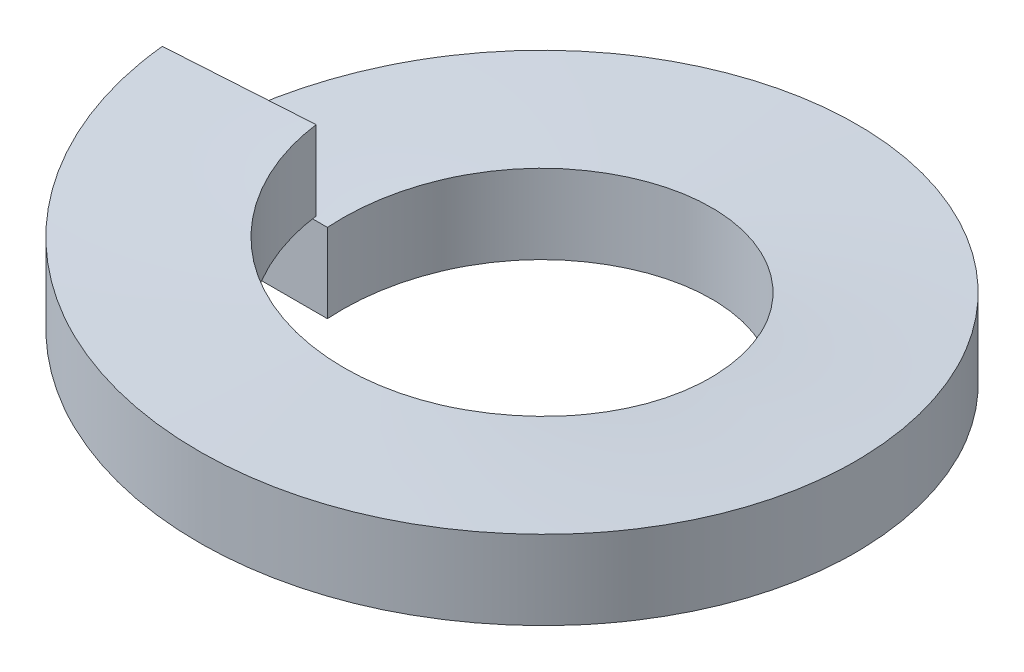
ISO-10303-21;
HEADER;
FILE_DESCRIPTION(('STEP AP214'),'2;1');
FILE_NAME('part.step','',(''),(''),'','','');
FILE_SCHEMA(('AUTOMOTIVE_DESIGN { 1 0 10303 214 1 1 1 1 }'));
ENDSEC;
DATA;
#1=APPLICATION_CONTEXT('core data for automotive mechanical design processes');
#2=APPLICATION_PROTOCOL_DEFINITION('international standard','automotive_design',2000,#1);
#3=PRODUCT_CONTEXT('',#1,'mechanical');
#4=PRODUCT('Part','Part','',(#3));
#5=PRODUCT_RELATED_PRODUCT_CATEGORY('part','',(#4));
#6=PRODUCT_DEFINITION_FORMATION('','',#4);
#7=PRODUCT_DEFINITION_CONTEXT('part definition',#1,'design');
#8=PRODUCT_DEFINITION('design','',#6,#7);
#9=PRODUCT_DEFINITION_SHAPE('','',#8);
#10=(LENGTH_UNIT() NAMED_UNIT(*) SI_UNIT(.MILLI.,.METRE.));
#11=(NAMED_UNIT(*) PLANE_ANGLE_UNIT() SI_UNIT($,.RADIAN.));
#12=(NAMED_UNIT(*) SI_UNIT($,.STERADIAN.) SOLID_ANGLE_UNIT());
#13=UNCERTAINTY_MEASURE_WITH_UNIT(LENGTH_MEASURE(1.E-05),#10,'distance_accuracy_value','');
#14=(GEOMETRIC_REPRESENTATION_CONTEXT(3) GLOBAL_UNCERTAINTY_ASSIGNED_CONTEXT((#13)) GLOBAL_UNIT_ASSIGNED_CONTEXT((#10,
#11,#12)) REPRESENTATION_CONTEXT('',''));
#15=CARTESIAN_POINT('',(0.,0.,0.));
#16=DIRECTION('',(0.,0.,1.));
#17=DIRECTION('',(1.,0.,0.));
#18=AXIS2_PLACEMENT_3D('',#15,#16,#17);
#19=CARTESIAN_POINT('',(-3.175,0.762,0.));
#20=DIRECTION('',(0.,0.,1.));
#21=DIRECTION('',(1.,0.,0.));
#22=AXIS2_PLACEMENT_3D('',#19,#20,#21);
#23=PLANE('',#22);
#24=DIRECTION('',(0.,-1.,0.));
#25=VECTOR('',#24,1.);
#26=CARTESIAN_POINT('',(-3.175,0.762,0.));
#27=LINE('',#26,#25);
#28=CARTESIAN_POINT('',(-3.175,0.762,0.));
#29=VERTEX_POINT('',#28);
#30=CARTESIAN_POINT('',(-3.175,0.,0.));
#31=VERTEX_POINT('',#30);
#32=EDGE_CURVE('E84',#29,#31,#27,.T.);
#33=ORIENTED_EDGE('',*,*,#32,.T.);
#34=DIRECTION('',(1.,0.,0.));
#35=VECTOR('',#34,1.);
#36=CARTESIAN_POINT('',(-3.175,0.,0.));
#37=LINE('',#36,#35);
#38=CARTESIAN_POINT('',(-1.778,0.,0.));
#39=VERTEX_POINT('',#38);
#40=EDGE_CURVE('E77',#31,#39,#37,.T.);
#41=ORIENTED_EDGE('',*,*,#40,.T.);
#42=DIRECTION('',(0.,1.,0.));
#43=VECTOR('',#42,1.);
#44=CARTESIAN_POINT('',(-1.778,0.762,0.));
#45=LINE('',#44,#43);
#46=CARTESIAN_POINT('',(-1.778,0.762,0.));
#47=VERTEX_POINT('',#46);
#48=EDGE_CURVE('E72',#39,#47,#45,.T.);
#49=ORIENTED_EDGE('',*,*,#48,.T.);
#50=DIRECTION('',(-1.,0.,0.));
#51=VECTOR('',#50,1.);
#52=CARTESIAN_POINT('',(-3.175,0.762,0.));
#53=LINE('',#52,#51);
#54=EDGE_CURVE('E67',#47,#29,#53,.T.);
#55=ORIENTED_EDGE('',*,*,#54,.T.);
#56=EDGE_LOOP('',(#33,#41,#49,#55));
#57=FACE_BOUND('',#56,.T.);
#58=ADVANCED_FACE('F32',(#57),#23,.T.);
#59=CARTESIAN_POINT('',(-3.16873486275976,1.6764,0.199359899505527));
#60=DIRECTION('',(0.0627905195293,0.,0.998026728428272));
#61=DIRECTION('',(0.998026728428272,0.,-0.0627905195293));
#62=AXIS2_PLACEMENT_3D('',#59,#60,#61);
#63=PLANE('',#62);
#64=DIRECTION('',(0.,-1.,0.));
#65=VECTOR('',#64,1.);
#66=CARTESIAN_POINT('',(-3.16873486275976,1.6764,0.199359899505527));
#67=LINE('',#66,#65);
#68=CARTESIAN_POINT('',(-3.16873486275976,1.6764,0.199359899505526));
#69=VERTEX_POINT('',#68);
#70=CARTESIAN_POINT('',(-3.16873486275977,0.9144,0.199359899505526));
#71=VERTEX_POINT('',#70);
#72=EDGE_CURVE('E92',#69,#71,#67,.T.);
#73=ORIENTED_EDGE('',*,*,#72,.F.);
#74=DIRECTION('',(-0.998026728428272,0.,0.0627905195293));
#75=VECTOR('',#74,1.);
#76=CARTESIAN_POINT('',(-3.16873486275976,1.6764,0.199359899505527));
#77=LINE('',#76,#75);
#78=CARTESIAN_POINT('',(-1.77449152314547,1.6764,0.111641543723095));
#79=VERTEX_POINT('',#78);
#80=EDGE_CURVE('E11',#79,#69,#77,.T.);
#81=ORIENTED_EDGE('',*,*,#80,.F.);
#82=DIRECTION('',(0.,1.,0.));
#83=VECTOR('',#82,1.);
#84=CARTESIAN_POINT('',(-1.77449152314547,1.6764,0.111641543723095));
#85=LINE('',#84,#83);
#86=CARTESIAN_POINT('',(-1.77449152314547,0.9144,0.111641543723095));
#87=VERTEX_POINT('',#86);
#88=EDGE_CURVE('E46',#87,#79,#85,.T.);
#89=ORIENTED_EDGE('',*,*,#88,.F.);
#90=DIRECTION('',(0.998026728428272,0.,-0.0627905195293));
#91=VECTOR('',#90,1.);
#92=CARTESIAN_POINT('',(-3.16873486275977,0.9144,0.199359899505527));
#93=LINE('',#92,#91);
#94=EDGE_CURVE('E55',#71,#87,#93,.T.);
#95=ORIENTED_EDGE('',*,*,#94,.F.);
#96=EDGE_LOOP('',(#73,#81,#89,#95));
#97=FACE_BOUND('',#96,.T.);
#98=ADVANCED_FACE('F138',(#97),#63,.F.);
#99=CARTESIAN_POINT('',(0.,0.,0.));
#100=DIRECTION('',(0.,1.,0.));
#101=DIRECTION('',(0.,0.,1.));
#102=AXIS2_PLACEMENT_3D('',#99,#100,#101);
#103=CYLINDRICAL_SURFACE('',#102,3.175);
#104=CARTESIAN_POINT('',(-3.175,0.,0.));
#105=CARTESIAN_POINT('',(-3.175,0.0762,-1.81098802671272));
#106=CARTESIAN_POINT('',(-1.61620649500742,0.1524,-2.73285593573752));
#107=CARTESIAN_POINT('',(-0.0574129900148447,0.2286,-3.65472384476233));
#108=CARTESIAN_POINT('',(1.52956791527296,0.3048,-2.78227370913926));
#109=CARTESIAN_POINT('',(3.11654882056076,0.381,-1.90982357351619));
#110=CARTESIAN_POINT('',(3.1734333291612,0.4572,-0.0997291600730346));
#111=CARTESIAN_POINT('',(3.23031783776163,0.5334,1.71036525337012));
#112=CARTESIAN_POINT('',(1.70125007405829,0.6096,2.68074116346891));
#113=CARTESIAN_POINT('',(0.172182310354944,0.6858,3.65111707356771));
#114=CARTESIAN_POINT('',(-1.44141983667309,0.762,2.82894571429805));
#115=CARTESIAN_POINT('',(-3.05502198370113,0.8382,2.00677435502839));
#116=CARTESIAN_POINT('',(-3.16873486275977,0.9144,0.199359899505525));
#117=(BOUNDED_CURVE() B_SPLINE_CURVE(2,(#104,#105,#106,#107,#108,#109,#110,#111,#112,#113,#114,
#115,#116),.UNSPECIFIED.,.F.,.F.) B_SPLINE_CURVE_WITH_KNOTS((3,2,2,2,2,2,3),(0.,
0.166666666666667,0.333333333333333,0.5,0.666666666666667,0.833333333333333,1.),
.UNSPECIFIED.) CURVE() GEOMETRIC_REPRESENTATION_ITEM() RATIONAL_B_SPLINE_CURVE((1.,
0.868631514438191,1.,0.868631514438191,1.,0.868631514438191,1.,0.868631514438191,1.,
0.868631514438191,1.,0.868631514438191,1.)) REPRESENTATION_ITEM(''));
#118=EDGE_CURVE('E87',#31,#71,#117,.T.);
#119=ORIENTED_EDGE('',*,*,#118,.F.);
#120=ORIENTED_EDGE('',*,*,#32,.F.);
#121=CARTESIAN_POINT('',(-3.175,0.762,0.));
#122=CARTESIAN_POINT('',(-3.175,0.8382,-1.81098802671272));
#123=CARTESIAN_POINT('',(-1.61620649500742,0.9144,-2.73285593573752));
#124=CARTESIAN_POINT('',(-0.0574129900148447,0.9906,-3.65472384476233));
#125=CARTESIAN_POINT('',(1.52956791527296,1.0668,-2.78227370913926));
#126=CARTESIAN_POINT('',(3.11654882056076,1.143,-1.90982357351619));
#127=CARTESIAN_POINT('',(3.1734333291612,1.2192,-0.0997291600730346));
#128=CARTESIAN_POINT('',(3.23031783776163,1.2954,1.71036525337012));
#129=CARTESIAN_POINT('',(1.70125007405829,1.3716,2.68074116346891));
#130=CARTESIAN_POINT('',(0.172182310354944,1.4478,3.65111707356771));
#131=CARTESIAN_POINT('',(-1.44141983667309,1.524,2.82894571429805));
#132=CARTESIAN_POINT('',(-3.05502198370113,1.6002,2.00677435502839));
#133=CARTESIAN_POINT('',(-3.16873486275976,1.6764,0.199359899505525));
#134=(BOUNDED_CURVE() B_SPLINE_CURVE(2,(#121,#122,#123,#124,#125,#126,#127,#128,#129,#130,#131,
#132,#133),.UNSPECIFIED.,.F.,.F.) B_SPLINE_CURVE_WITH_KNOTS((3,2,2,2,2,2,3),(0.,
0.166666666666667,0.333333333333333,0.5,0.666666666666667,0.833333333333333,1.),
.UNSPECIFIED.) CURVE() GEOMETRIC_REPRESENTATION_ITEM() RATIONAL_B_SPLINE_CURVE((1.,
0.868631514438191,1.,0.868631514438191,1.,0.868631514438191,1.,0.868631514438191,1.,
0.868631514438191,1.,0.868631514438191,1.)) REPRESENTATION_ITEM(''));
#135=EDGE_CURVE('E86',#29,#69,#134,.T.);
#136=ORIENTED_EDGE('',*,*,#135,.T.);
#137=ORIENTED_EDGE('',*,*,#72,.T.);
#138=EDGE_LOOP('',(#119,#120,#136,#137));
#139=FACE_BOUND('',#138,.T.);
#140=ADVANCED_FACE('F85',(#139),#103,.T.);
#141=CARTESIAN_POINT('',(-3.175,0.,0.));
#142=CARTESIAN_POINT('',(-3.175,0.0762,-1.81098802671272));
#143=CARTESIAN_POINT('',(-1.61620649500742,0.1524,-2.73285593573753));
#144=CARTESIAN_POINT('',(-0.0574129900148447,0.2286,-3.65472384476233));
#145=CARTESIAN_POINT('',(1.52956791527296,0.3048,-2.78227370913926));
#146=CARTESIAN_POINT('',(3.11654882056076,0.381,-1.90982357351619));
#147=CARTESIAN_POINT('',(3.1734333291612,0.4572,-0.0997291600730346));
#148=CARTESIAN_POINT('',(3.23031783776163,0.5334,1.71036525337012));
#149=CARTESIAN_POINT('',(1.70125007405829,0.6096,2.68074116346891));
#150=CARTESIAN_POINT('',(0.172182310354944,0.6858,3.65111707356771));
#151=CARTESIAN_POINT('',(-1.44141983667309,0.762,2.82894571429805));
#152=CARTESIAN_POINT('',(-3.05502198370113,0.8382,2.00677435502839));
#153=CARTESIAN_POINT('',(-3.16873486275977,0.9144,0.199359899505525));
#154=CARTESIAN_POINT('',(-1.778,0.,0.));
#155=CARTESIAN_POINT('',(-1.778,0.0762,-1.01415329495912));
#156=CARTESIAN_POINT('',(-0.905075637204157,0.1524,-1.53039932401301));
#157=CARTESIAN_POINT('',(-0.032151274408313,0.2286,-2.04664535306691));
#158=CARTESIAN_POINT('',(0.856558032552857,0.3048,-1.55807327711799));
#159=CARTESIAN_POINT('',(1.74526733951403,0.381,-1.06950120116906));
#160=CARTESIAN_POINT('',(1.77712266433027,0.4572,-0.0558483296408994));
#161=CARTESIAN_POINT('',(1.80897798914651,0.5334,0.957804541887265));
#162=CARTESIAN_POINT('',(0.952700041472642,0.6096,1.50121505154259));
#163=CARTESIAN_POINT('',(0.0964220937987685,0.6858,2.04462556119792));
#164=CARTESIAN_POINT('',(-0.807195108536932,0.762,1.58420960000691));
#165=CARTESIAN_POINT('',(-1.71081231087263,0.8382,1.1237936388159));
#166=CARTESIAN_POINT('',(-1.77449152314547,0.9144,0.111641543723094));
#167=(BOUNDED_SURFACE() B_SPLINE_SURFACE(1,2,((#141,#142,#143,#144,#145,#146,#147,#148,#149,
#150,#151,#152,#153),(#154,#155,#156,#157,#158,#159,#160,#161,#162,#163,#164,#165,#166)),
.UNSPECIFIED.,.F.,.F.,.F.) B_SPLINE_SURFACE_WITH_KNOTS((2,2),(3,2,2,2,2,2,3),(0.,1.),(0.,
0.166666666666667,0.333333333333333,0.5,0.666666666666667,0.833333333333333,1.),
.UNSPECIFIED.) GEOMETRIC_REPRESENTATION_ITEM() RATIONAL_B_SPLINE_SURFACE(((1.,0.868631514438191,
1.,0.868631514438191,1.,0.868631514438191,1.,0.868631514438191,1.,0.868631514438191,1.,
0.868631514438191,1.),(1.,0.868631514438191,1.,0.868631514438191,1.,0.868631514438191,1.,
0.868631514438191,1.,0.868631514438191,1.,0.868631514438191,1.))) REPRESENTATION_ITEM('') SURFACE());
#168=CARTESIAN_POINT('',(-1.778,0.,0.));
#169=CARTESIAN_POINT('',(-1.778,0.0762,-1.01415329495912));
#170=CARTESIAN_POINT('',(-0.905075637204157,0.1524,-1.53039932401301));
#171=CARTESIAN_POINT('',(-0.032151274408313,0.2286,-2.04664535306691));
#172=CARTESIAN_POINT('',(0.856558032552857,0.3048,-1.55807327711799));
#173=CARTESIAN_POINT('',(1.74526733951403,0.381,-1.06950120116906));
#174=CARTESIAN_POINT('',(1.77712266433027,0.4572,-0.0558483296408994));
#175=CARTESIAN_POINT('',(1.80897798914651,0.5334,0.957804541887265));
#176=CARTESIAN_POINT('',(0.952700041472642,0.6096,1.50121505154259));
#177=CARTESIAN_POINT('',(0.0964220937987685,0.6858,2.04462556119792));
#178=CARTESIAN_POINT('',(-0.807195108536932,0.762,1.58420960000691));
#179=CARTESIAN_POINT('',(-1.71081231087263,0.8382,1.1237936388159));
#180=CARTESIAN_POINT('',(-1.77449152314547,0.9144,0.111641543723094));
#181=(BOUNDED_CURVE() B_SPLINE_CURVE(2,(#168,#169,#170,#171,#172,#173,#174,#175,#176,#177,#178,
#179,#180),.UNSPECIFIED.,.F.,.F.) B_SPLINE_CURVE_WITH_KNOTS((3,2,2,2,2,2,3),(0.,
0.166666666666667,0.333333333333333,0.5,0.666666666666667,0.833333333333333,1.),
.UNSPECIFIED.) CURVE() GEOMETRIC_REPRESENTATION_ITEM() RATIONAL_B_SPLINE_CURVE((1.,
0.868631514438191,1.,0.868631514438191,1.,0.868631514438191,1.,0.868631514438191,1.,
0.868631514438191,1.,0.868631514438191,1.)) REPRESENTATION_ITEM(''));
#182=EDGE_CURVE('E107',#39,#87,#181,.T.);
#183=ORIENTED_EDGE('',*,*,#182,.F.);
#184=ORIENTED_EDGE('',*,*,#40,.F.);
#185=ORIENTED_EDGE('',*,*,#118,.T.);
#186=ORIENTED_EDGE('',*,*,#94,.T.);
#187=EDGE_LOOP('',(#183,#184,#185,#186));
#188=FACE_BOUND('',#187,.T.);
#189=ADVANCED_FACE('F125',(#188),#167,.F.);
#190=CARTESIAN_POINT('',(0.,0.,0.));
#191=DIRECTION('',(0.,1.,0.));
#192=DIRECTION('',(0.,0.,1.));
#193=AXIS2_PLACEMENT_3D('',#190,#191,#192);
#194=CYLINDRICAL_SURFACE('',#193,1.778);
#195=CARTESIAN_POINT('',(-1.778,0.762,0.));
#196=CARTESIAN_POINT('',(-1.778,0.8382,-1.01415329495912));
#197=CARTESIAN_POINT('',(-0.905075637204156,0.9144,-1.53039932401301));
#198=CARTESIAN_POINT('',(-0.032151274408313,0.9906,-2.04664535306691));
#199=CARTESIAN_POINT('',(0.856558032552857,1.0668,-1.55807327711798));
#200=CARTESIAN_POINT('',(1.74526733951403,1.143,-1.06950120116906));
#201=CARTESIAN_POINT('',(1.77712266433027,1.2192,-0.0558483296408993));
#202=CARTESIAN_POINT('',(1.80897798914651,1.2954,0.957804541887264));
#203=CARTESIAN_POINT('',(0.952700041472642,1.3716,1.50121505154259));
#204=CARTESIAN_POINT('',(0.0964220937987685,1.4478,2.04462556119792));
#205=CARTESIAN_POINT('',(-0.807195108536932,1.524,1.58420960000691));
#206=CARTESIAN_POINT('',(-1.71081231087263,1.6002,1.1237936388159));
#207=CARTESIAN_POINT('',(-1.77449152314547,1.6764,0.111641543723094));
#208=(BOUNDED_CURVE() B_SPLINE_CURVE(2,(#195,#196,#197,#198,#199,#200,#201,#202,#203,#204,#205,
#206,#207),.UNSPECIFIED.,.F.,.F.) B_SPLINE_CURVE_WITH_KNOTS((3,2,2,2,2,2,3),(0.,
0.166666666666667,0.333333333333333,0.5,0.666666666666667,0.833333333333333,1.),
.UNSPECIFIED.) CURVE() GEOMETRIC_REPRESENTATION_ITEM() RATIONAL_B_SPLINE_CURVE((1.,
0.868631514438191,1.,0.868631514438191,1.,0.868631514438191,1.,0.868631514438191,1.,
0.868631514438191,1.,0.868631514438191,1.)) REPRESENTATION_ITEM(''));
#209=EDGE_CURVE('E39',#47,#79,#208,.T.);
#210=ORIENTED_EDGE('',*,*,#209,.F.);
#211=ORIENTED_EDGE('',*,*,#48,.F.);
#212=ORIENTED_EDGE('',*,*,#182,.T.);
#213=ORIENTED_EDGE('',*,*,#88,.T.);
#214=EDGE_LOOP('',(#210,#211,#212,#213));
#215=FACE_BOUND('',#214,.T.);
#216=ADVANCED_FACE('F123',(#215),#194,.F.);
#217=CARTESIAN_POINT('',(-1.778,0.762,0.));
#218=CARTESIAN_POINT('',(-1.778,0.8382,-1.01415329495912));
#219=CARTESIAN_POINT('',(-0.905075637204156,0.9144,-1.53039932401301));
#220=CARTESIAN_POINT('',(-0.032151274408313,0.9906,-2.04664535306691));
#221=CARTESIAN_POINT('',(0.856558032552857,1.0668,-1.55807327711798));
#222=CARTESIAN_POINT('',(1.74526733951403,1.143,-1.06950120116906));
#223=CARTESIAN_POINT('',(1.77712266433027,1.2192,-0.0558483296408994));
#224=CARTESIAN_POINT('',(1.80897798914651,1.2954,0.957804541887264));
#225=CARTESIAN_POINT('',(0.952700041472642,1.3716,1.50121505154259));
#226=CARTESIAN_POINT('',(0.0964220937987685,1.4478,2.04462556119792));
#227=CARTESIAN_POINT('',(-0.807195108536932,1.524,1.58420960000691));
#228=CARTESIAN_POINT('',(-1.71081231087263,1.6002,1.1237936388159));
#229=CARTESIAN_POINT('',(-1.77449152314547,1.6764,0.111641543723094));
#230=CARTESIAN_POINT('',(-3.175,0.762,0.));
#231=CARTESIAN_POINT('',(-3.175,0.8382,-1.81098802671272));
#232=CARTESIAN_POINT('',(-1.61620649500742,0.9144,-2.73285593573752));
#233=CARTESIAN_POINT('',(-0.0574129900148447,0.9906,-3.65472384476233));
#234=CARTESIAN_POINT('',(1.52956791527296,1.0668,-2.78227370913926));
#235=CARTESIAN_POINT('',(3.11654882056076,1.143,-1.90982357351619));
#236=CARTESIAN_POINT('',(3.1734333291612,1.2192,-0.0997291600730346));
#237=CARTESIAN_POINT('',(3.23031783776163,1.2954,1.71036525337012));
#238=CARTESIAN_POINT('',(1.70125007405829,1.3716,2.68074116346891));
#239=CARTESIAN_POINT('',(0.172182310354944,1.4478,3.65111707356771));
#240=CARTESIAN_POINT('',(-1.44141983667309,1.524,2.82894571429805));
#241=CARTESIAN_POINT('',(-3.05502198370113,1.6002,2.00677435502839));
#242=CARTESIAN_POINT('',(-3.16873486275976,1.6764,0.199359899505525));
#243=(BOUNDED_SURFACE() B_SPLINE_SURFACE(1,2,((#217,#218,#219,#220,#221,#222,#223,#224,#225,
#226,#227,#228,#229),(#230,#231,#232,#233,#234,#235,#236,#237,#238,#239,#240,#241,#242)),
.UNSPECIFIED.,.F.,.F.,.F.) B_SPLINE_SURFACE_WITH_KNOTS((2,2),(3,2,2,2,2,2,3),(0.,1.),(0.,
0.166666666666667,0.333333333333333,0.5,0.666666666666667,0.833333333333333,1.),
.UNSPECIFIED.) GEOMETRIC_REPRESENTATION_ITEM() RATIONAL_B_SPLINE_SURFACE(((1.,0.868631514438191,
1.,0.868631514438191,1.,0.868631514438191,1.,0.868631514438191,1.,0.868631514438191,1.,
0.868631514438191,1.),(1.,0.868631514438191,1.,0.868631514438191,1.,0.868631514438191,1.,
0.868631514438191,1.,0.868631514438191,1.,0.868631514438191,1.))) REPRESENTATION_ITEM('') SURFACE());
#244=ORIENTED_EDGE('',*,*,#80,.T.);
#245=ORIENTED_EDGE('',*,*,#135,.F.);
#246=ORIENTED_EDGE('',*,*,#54,.F.);
#247=ORIENTED_EDGE('',*,*,#209,.T.);
#248=EDGE_LOOP('',(#244,#245,#246,#247));
#249=FACE_BOUND('',#248,.T.);
#250=ADVANCED_FACE('F90',(#249),#243,.F.);
#251=CLOSED_SHELL('',(#58,#98,#140,#189,#216,#250));
#252=MANIFOLD_SOLID_BREP('B2',#251);
#253=ADVANCED_BREP_SHAPE_REPRESENTATION('',(#18,#252),#14);
#254=SHAPE_DEFINITION_REPRESENTATION(#9,#253);
ENDSEC;
END-ISO-10303-21;
